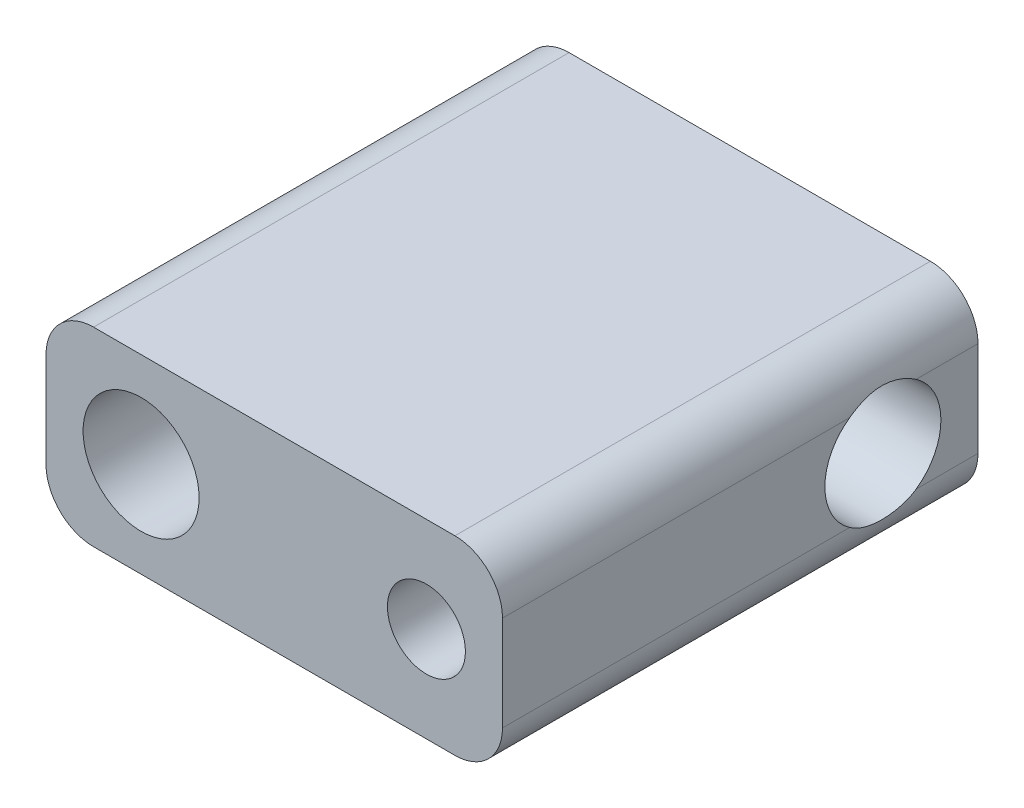
ISO-10303-21;
HEADER;
FILE_DESCRIPTION(('STEP AP214'),'2;1');
FILE_NAME('part.step','',(''),(''),'','','');
FILE_SCHEMA(('AUTOMOTIVE_DESIGN { 1 0 10303 214 1 1 1 1 }'));
ENDSEC;
DATA;
#1=APPLICATION_CONTEXT('core data for automotive mechanical design processes');
#2=APPLICATION_PROTOCOL_DEFINITION('international standard','automotive_design',2000,#1);
#3=PRODUCT_CONTEXT('',#1,'mechanical');
#4=PRODUCT('Part','Part','',(#3));
#5=PRODUCT_RELATED_PRODUCT_CATEGORY('part','',(#4));
#6=PRODUCT_DEFINITION_FORMATION('','',#4);
#7=PRODUCT_DEFINITION_CONTEXT('part definition',#1,'design');
#8=PRODUCT_DEFINITION('design','',#6,#7);
#9=PRODUCT_DEFINITION_SHAPE('','',#8);
#10=(LENGTH_UNIT() NAMED_UNIT(*) SI_UNIT(.MILLI.,.METRE.));
#11=(NAMED_UNIT(*) PLANE_ANGLE_UNIT() SI_UNIT($,.RADIAN.));
#12=(NAMED_UNIT(*) SI_UNIT($,.STERADIAN.) SOLID_ANGLE_UNIT());
#13=UNCERTAINTY_MEASURE_WITH_UNIT(LENGTH_MEASURE(1.E-05),#10,'distance_accuracy_value','');
#14=(GEOMETRIC_REPRESENTATION_CONTEXT(3) GLOBAL_UNCERTAINTY_ASSIGNED_CONTEXT((#13)) GLOBAL_UNIT_ASSIGNED_CONTEXT((#10,
#11,#12)) REPRESENTATION_CONTEXT('',''));
#15=CARTESIAN_POINT('',(0.,0.,0.));
#16=DIRECTION('',(0.,0.,1.));
#17=DIRECTION('',(1.,0.,0.));
#18=AXIS2_PLACEMENT_3D('',#15,#16,#17);
#19=CARTESIAN_POINT('',(24.,10.,30.));
#20=DIRECTION('',(-1.,0.,0.));
#21=DIRECTION('',(0.,0.,1.));
#22=AXIS2_PLACEMENT_3D('',#19,#20,#21);
#23=PLANE('',#22);
#24=DIRECTION('',(0.,1.,0.));
#25=VECTOR('',#24,1.);
#26=CARTESIAN_POINT('',(24.,10.,30.));
#27=LINE('',#26,#25);
#28=CARTESIAN_POINT('',(24.,-5.,30.));
#29=VERTEX_POINT('',#28);
#30=CARTESIAN_POINT('',(24.,5.,30.));
#31=VERTEX_POINT('',#30);
#32=EDGE_CURVE('E237',#29,#31,#27,.T.);
#33=ORIENTED_EDGE('',*,*,#32,.F.);
#34=DIRECTION('',(0.,0.,-1.));
#35=VECTOR('',#34,1.);
#36=CARTESIAN_POINT('',(24.,-5.,30.));
#37=LINE('',#36,#35);
#38=CARTESIAN_POINT('',(24.,-5.,-6.50571895806876));
#39=VERTEX_POINT('',#38);
#40=EDGE_CURVE('E172',#29,#39,#37,.T.);
#41=ORIENTED_EDGE('',*,*,#40,.T.);
#42=CARTESIAN_POINT('',(24.,0.,-10.));
#43=DIRECTION('',(1.,0.,0.));
#44=DIRECTION('',(0.,0.,-1.));
#45=AXIS2_PLACEMENT_3D('',#42,#43,#44);
#46=CIRCLE('',#45,6.1);
#47=CARTESIAN_POINT('',(24.,5.,-6.50571895806876));
#48=VERTEX_POINT('',#47);
#49=EDGE_CURVE('E336',#48,#39,#46,.T.);
#50=ORIENTED_EDGE('',*,*,#49,.F.);
#51=DIRECTION('',(0.,0.,-1.));
#52=VECTOR('',#51,1.);
#53=CARTESIAN_POINT('',(24.,5.,30.));
#54=LINE('',#53,#52);
#55=EDGE_CURVE('E166',#48,#31,#54,.F.);
#56=ORIENTED_EDGE('',*,*,#55,.T.);
#57=EDGE_LOOP('',(#33,#41,#50,#56));
#58=FACE_BOUND('',#57,.T.);
#59=ADVANCED_FACE('F33',(#58),#23,.F.);
#60=CARTESIAN_POINT('',(0.,0.,30.));
#61=DIRECTION('',(0.,0.,1.));
#62=DIRECTION('',(1.,0.,0.));
#63=AXIS2_PLACEMENT_3D('',#60,#61,#62);
#64=PLANE('',#63);
#65=CARTESIAN_POINT('',(-14.,0.,30.));
#66=DIRECTION('',(0.,0.,1.));
#67=DIRECTION('',(1.,0.,0.));
#68=AXIS2_PLACEMENT_3D('',#65,#66,#67);
#69=CIRCLE('',#68,6.1);
#70=CARTESIAN_POINT('',(-7.9,0.,30.));
#71=VERTEX_POINT('',#70);
#72=EDGE_CURVE('E243',#71,#71,#69,.T.);
#73=ORIENTED_EDGE('',*,*,#72,.F.);
#74=EDGE_LOOP('',(#73));
#75=FACE_BOUND('',#74,.T.);
#76=DIRECTION('',(0.,-1.,0.));
#77=VECTOR('',#76,1.);
#78=CARTESIAN_POINT('',(-24.,10.,30.));
#79=LINE('',#78,#77);
#80=CARTESIAN_POINT('',(-24.,5.,30.));
#81=VERTEX_POINT('',#80);
#82=CARTESIAN_POINT('',(-24.,-5.,30.));
#83=VERTEX_POINT('',#82);
#84=EDGE_CURVE('E141',#81,#83,#79,.T.);
#85=ORIENTED_EDGE('',*,*,#84,.T.);
#86=CARTESIAN_POINT('',(-19.,-5.,30.));
#87=DIRECTION('',(0.,0.,1.));
#88=DIRECTION('',(1.,0.,0.));
#89=AXIS2_PLACEMENT_3D('',#86,#87,#88);
#90=CIRCLE('',#89,5.);
#91=CARTESIAN_POINT('',(-19.,-10.,30.));
#92=VERTEX_POINT('',#91);
#93=EDGE_CURVE('E159',#83,#92,#90,.T.);
#94=ORIENTED_EDGE('',*,*,#93,.T.);
#95=DIRECTION('',(1.,0.,0.));
#96=VECTOR('',#95,1.);
#97=CARTESIAN_POINT('',(-24.,-10.,30.));
#98=LINE('',#97,#96);
#99=CARTESIAN_POINT('',(19.,-10.,30.));
#100=VERTEX_POINT('',#99);
#101=EDGE_CURVE('E138',#92,#100,#98,.T.);
#102=ORIENTED_EDGE('',*,*,#101,.T.);
#103=CARTESIAN_POINT('',(19.,-5.,30.));
#104=DIRECTION('',(0.,0.,1.));
#105=DIRECTION('',(1.,0.,0.));
#106=AXIS2_PLACEMENT_3D('',#103,#104,#105);
#107=CIRCLE('',#106,5.);
#108=EDGE_CURVE('E137',#100,#29,#107,.T.);
#109=ORIENTED_EDGE('',*,*,#108,.T.);
#110=ORIENTED_EDGE('',*,*,#32,.T.);
#111=CARTESIAN_POINT('',(19.,5.,30.));
#112=DIRECTION('',(0.,0.,1.));
#113=DIRECTION('',(1.,0.,0.));
#114=AXIS2_PLACEMENT_3D('',#111,#112,#113);
#115=CIRCLE('',#114,5.);
#116=CARTESIAN_POINT('',(19.,10.,30.));
#117=VERTEX_POINT('',#116);
#118=EDGE_CURVE('E154',#31,#117,#115,.T.);
#119=ORIENTED_EDGE('',*,*,#118,.T.);
#120=DIRECTION('',(-1.,0.,0.));
#121=VECTOR('',#120,1.);
#122=CARTESIAN_POINT('',(-24.,10.,30.));
#123=LINE('',#122,#121);
#124=CARTESIAN_POINT('',(-19.,10.,30.));
#125=VERTEX_POINT('',#124);
#126=EDGE_CURVE('E242',#117,#125,#123,.T.);
#127=ORIENTED_EDGE('',*,*,#126,.T.);
#128=CARTESIAN_POINT('',(-19.,5.,30.));
#129=DIRECTION('',(0.,0.,1.));
#130=DIRECTION('',(1.,0.,0.));
#131=AXIS2_PLACEMENT_3D('',#128,#129,#130);
#132=CIRCLE('',#131,5.);
#133=EDGE_CURVE('E157',#125,#81,#132,.T.);
#134=ORIENTED_EDGE('',*,*,#133,.T.);
#135=EDGE_LOOP('',(#85,#94,#102,#109,#110,#119,#127,#134));
#136=FACE_BOUND('',#135,.T.);
#137=CARTESIAN_POINT('',(16.,0.,30.));
#138=DIRECTION('',(0.,0.,1.));
#139=DIRECTION('',(1.,0.,0.));
#140=AXIS2_PLACEMENT_3D('',#137,#138,#139);
#141=CIRCLE('',#140,4.1);
#142=CARTESIAN_POINT('',(20.1,0.,30.));
#143=VERTEX_POINT('',#142);
#144=EDGE_CURVE('E267',#143,#143,#141,.T.);
#145=ORIENTED_EDGE('',*,*,#144,.F.);
#146=EDGE_LOOP('',(#145));
#147=FACE_BOUND('',#146,.T.);
#148=ADVANCED_FACE('F199',(#75,#136,#147),#64,.T.);
#149=CARTESIAN_POINT('',(24.,-5.,-13.4942810419312));
#150=VERTEX_POINT('',#149);
#151=CARTESIAN_POINT('',(24.,5.,-13.4942810419312));
#152=VERTEX_POINT('',#151);
#153=EDGE_CURVE('E338',#150,#152,#46,.T.);
#154=ORIENTED_EDGE('',*,*,#153,.F.);
#155=DIRECTION('',(0.,0.,-1.));
#156=VECTOR('',#155,1.);
#157=CARTESIAN_POINT('',(24.,-5.,30.));
#158=LINE('',#157,#156);
#159=CARTESIAN_POINT('',(24.,-5.,-20.));
#160=VERTEX_POINT('',#159);
#161=EDGE_CURVE('E170',#150,#160,#158,.T.);
#162=ORIENTED_EDGE('',*,*,#161,.T.);
#163=DIRECTION('',(0.,-1.,0.));
#164=VECTOR('',#163,1.);
#165=CARTESIAN_POINT('',(24.,10.,-20.));
#166=LINE('',#165,#164);
#167=CARTESIAN_POINT('',(24.,5.,-20.));
#168=VERTEX_POINT('',#167);
#169=EDGE_CURVE('E120',#168,#160,#166,.T.);
#170=ORIENTED_EDGE('',*,*,#169,.F.);
#171=DIRECTION('',(0.,0.,-1.));
#172=VECTOR('',#171,1.);
#173=CARTESIAN_POINT('',(24.,5.,30.));
#174=LINE('',#173,#172);
#175=EDGE_CURVE('E168',#168,#152,#174,.F.);
#176=ORIENTED_EDGE('',*,*,#175,.T.);
#177=EDGE_LOOP('',(#154,#162,#170,#176));
#178=FACE_BOUND('',#177,.T.);
#179=ADVANCED_FACE('F202',(#178),#23,.F.);
#180=CARTESIAN_POINT('',(-24.,10.,30.));
#181=DIRECTION('',(0.,-1.,0.));
#182=DIRECTION('',(0.,0.,-1.));
#183=AXIS2_PLACEMENT_3D('',#180,#181,#182);
#184=PLANE('',#183);
#185=DIRECTION('',(1.,0.,0.));
#186=VECTOR('',#185,1.);
#187=CARTESIAN_POINT('',(24.,10.,-20.));
#188=LINE('',#187,#186);
#189=CARTESIAN_POINT('',(-19.,10.,-20.));
#190=VERTEX_POINT('',#189);
#191=CARTESIAN_POINT('',(19.,10.,-20.));
#192=VERTEX_POINT('',#191);
#193=EDGE_CURVE('E260',#190,#192,#188,.T.);
#194=ORIENTED_EDGE('',*,*,#193,.F.);
#195=DIRECTION('',(0.,0.,-1.));
#196=VECTOR('',#195,1.);
#197=CARTESIAN_POINT('',(-19.,10.,30.));
#198=LINE('',#197,#196);
#199=EDGE_CURVE('E164',#190,#125,#198,.F.);
#200=ORIENTED_EDGE('',*,*,#199,.T.);
#201=ORIENTED_EDGE('',*,*,#126,.F.);
#202=DIRECTION('',(0.,0.,-1.));
#203=VECTOR('',#202,1.);
#204=CARTESIAN_POINT('',(19.,10.,30.));
#205=LINE('',#204,#203);
#206=EDGE_CURVE('E161',#117,#192,#205,.T.);
#207=ORIENTED_EDGE('',*,*,#206,.T.);
#208=EDGE_LOOP('',(#194,#200,#201,#207));
#209=FACE_BOUND('',#208,.T.);
#210=ADVANCED_FACE('F209',(#209),#184,.F.);
#211=CARTESIAN_POINT('',(-24.,10.,30.));
#212=DIRECTION('',(1.,0.,0.));
#213=DIRECTION('',(0.,1.,0.));
#214=AXIS2_PLACEMENT_3D('',#211,#212,#213);
#215=PLANE('',#214);
#216=DIRECTION('',(0.,1.,0.));
#217=VECTOR('',#216,1.);
#218=CARTESIAN_POINT('',(-24.,10.,-20.));
#219=LINE('',#218,#217);
#220=CARTESIAN_POINT('',(-24.,-5.,-20.));
#221=VERTEX_POINT('',#220);
#222=CARTESIAN_POINT('',(-24.,5.,-20.));
#223=VERTEX_POINT('',#222);
#224=EDGE_CURVE('E133',#221,#223,#219,.T.);
#225=ORIENTED_EDGE('',*,*,#224,.F.);
#226=DIRECTION('',(0.,0.,-1.));
#227=VECTOR('',#226,1.);
#228=CARTESIAN_POINT('',(-24.,-5.,30.));
#229=LINE('',#228,#227);
#230=EDGE_CURVE('E152',#221,#83,#229,.F.);
#231=ORIENTED_EDGE('',*,*,#230,.T.);
#232=ORIENTED_EDGE('',*,*,#84,.F.);
#233=DIRECTION('',(0.,0.,-1.));
#234=VECTOR('',#233,1.);
#235=CARTESIAN_POINT('',(-24.,5.,30.));
#236=LINE('',#235,#234);
#237=EDGE_CURVE('E149',#81,#223,#236,.T.);
#238=ORIENTED_EDGE('',*,*,#237,.T.);
#239=EDGE_LOOP('',(#225,#231,#232,#238));
#240=FACE_BOUND('',#239,.T.);
#241=ADVANCED_FACE('F206',(#240),#215,.F.);
#242=CARTESIAN_POINT('',(-24.,-10.,30.));
#243=DIRECTION('',(0.,1.,0.));
#244=DIRECTION('',(0.,0.,1.));
#245=AXIS2_PLACEMENT_3D('',#242,#243,#244);
#246=PLANE('',#245);
#247=ORIENTED_EDGE('',*,*,#101,.F.);
#248=DIRECTION('',(0.,0.,-1.));
#249=VECTOR('',#248,1.);
#250=CARTESIAN_POINT('',(-19.,-10.,30.));
#251=LINE('',#250,#249);
#252=CARTESIAN_POINT('',(-19.,-10.,-20.));
#253=VERTEX_POINT('',#252);
#254=EDGE_CURVE('E132',#92,#253,#251,.T.);
#255=ORIENTED_EDGE('',*,*,#254,.T.);
#256=DIRECTION('',(-1.,0.,0.));
#257=VECTOR('',#256,1.);
#258=CARTESIAN_POINT('',(24.,-10.,-20.));
#259=LINE('',#258,#257);
#260=CARTESIAN_POINT('',(19.,-10.,-20.));
#261=VERTEX_POINT('',#260);
#262=EDGE_CURVE('E118',#261,#253,#259,.T.);
#263=ORIENTED_EDGE('',*,*,#262,.F.);
#264=DIRECTION('',(0.,0.,-1.));
#265=VECTOR('',#264,1.);
#266=CARTESIAN_POINT('',(19.,-10.,30.));
#267=LINE('',#266,#265);
#268=EDGE_CURVE('E129',#261,#100,#267,.F.);
#269=ORIENTED_EDGE('',*,*,#268,.T.);
#270=EDGE_LOOP('',(#247,#255,#263,#269));
#271=FACE_BOUND('',#270,.T.);
#272=ADVANCED_FACE('F128',(#271),#246,.F.);
#273=CARTESIAN_POINT('',(-14.,0.,30.));
#274=DIRECTION('',(0.,0.,-1.));
#275=DIRECTION('',(-1.,0.,0.));
#276=AXIS2_PLACEMENT_3D('',#273,#274,#275);
#277=CYLINDRICAL_SURFACE('',#276,6.1);
#278=ORIENTED_EDGE('',*,*,#72,.T.);
#279=EDGE_LOOP('',(#278));
#280=FACE_BOUND('',#279,.T.);
#281=CARTESIAN_POINT('',(-14.,0.,0.));
#282=DIRECTION('',(0.,0.,1.));
#283=DIRECTION('',(1.,0.,0.));
#284=AXIS2_PLACEMENT_3D('',#281,#282,#283);
#285=CIRCLE('',#284,6.1);
#286=CARTESIAN_POINT('',(-7.9,0.,0.));
#287=VERTEX_POINT('',#286);
#288=EDGE_CURVE('E248',#287,#287,#285,.T.);
#289=ORIENTED_EDGE('',*,*,#288,.F.);
#290=EDGE_LOOP('',(#289));
#291=FACE_BOUND('',#290,.T.);
#292=ADVANCED_FACE('F194',(#280,#291),#277,.F.);
#293=CARTESIAN_POINT('',(16.,0.,30.));
#294=DIRECTION('',(0.,0.,-1.));
#295=DIRECTION('',(-1.,0.,0.));
#296=AXIS2_PLACEMENT_3D('',#293,#294,#295);
#297=CYLINDRICAL_SURFACE('',#296,4.1);
#298=ORIENTED_EDGE('',*,*,#144,.T.);
#299=EDGE_LOOP('',(#298));
#300=FACE_BOUND('',#299,.T.);
#301=CARTESIAN_POINT('',(16.,0.,0.));
#302=DIRECTION('',(0.,0.,1.));
#303=DIRECTION('',(1.,0.,0.));
#304=AXIS2_PLACEMENT_3D('',#301,#302,#303);
#305=CIRCLE('',#304,4.1);
#306=CARTESIAN_POINT('',(20.1,0.,0.));
#307=VERTEX_POINT('',#306);
#308=EDGE_CURVE('E263',#307,#307,#305,.T.);
#309=ORIENTED_EDGE('',*,*,#308,.F.);
#310=EDGE_LOOP('',(#309));
#311=FACE_BOUND('',#310,.T.);
#312=ADVANCED_FACE('F191',(#300,#311),#297,.F.);
#313=CARTESIAN_POINT('',(0.,0.,0.));
#314=DIRECTION('',(0.,0.,-1.));
#315=DIRECTION('',(-1.,0.,0.));
#316=AXIS2_PLACEMENT_3D('',#313,#314,#315);
#317=PLANE('',#316);
#318=ORIENTED_EDGE('',*,*,#308,.T.);
#319=EDGE_LOOP('',(#318));
#320=FACE_BOUND('',#319,.T.);
#321=ADVANCED_FACE('F189',(#320),#317,.F.);
#322=ORIENTED_EDGE('',*,*,#288,.T.);
#323=EDGE_LOOP('',(#322));
#324=FACE_BOUND('',#323,.T.);
#325=ADVANCED_FACE('F186',(#324),#317,.F.);
#326=CARTESIAN_POINT('',(0.,0.,-20.));
#327=DIRECTION('',(0.,0.,-1.));
#328=DIRECTION('',(-1.,0.,0.));
#329=AXIS2_PLACEMENT_3D('',#326,#327,#328);
#330=PLANE('',#329);
#331=ORIENTED_EDGE('',*,*,#262,.T.);
#332=CARTESIAN_POINT('',(-19.,-5.,-20.));
#333=DIRECTION('',(0.,0.,-1.));
#334=DIRECTION('',(-1.,0.,0.));
#335=AXIS2_PLACEMENT_3D('',#332,#333,#334);
#336=CIRCLE('',#335,5.);
#337=EDGE_CURVE('E147',#253,#221,#336,.T.);
#338=ORIENTED_EDGE('',*,*,#337,.T.);
#339=ORIENTED_EDGE('',*,*,#224,.T.);
#340=CARTESIAN_POINT('',(-19.,5.,-20.));
#341=DIRECTION('',(0.,0.,-1.));
#342=DIRECTION('',(-1.,0.,0.));
#343=AXIS2_PLACEMENT_3D('',#340,#341,#342);
#344=CIRCLE('',#343,5.);
#345=EDGE_CURVE('E122',#223,#190,#344,.T.);
#346=ORIENTED_EDGE('',*,*,#345,.T.);
#347=ORIENTED_EDGE('',*,*,#193,.T.);
#348=CARTESIAN_POINT('',(19.,5.,-20.));
#349=DIRECTION('',(0.,0.,-1.));
#350=DIRECTION('',(-1.,0.,0.));
#351=AXIS2_PLACEMENT_3D('',#348,#349,#350);
#352=CIRCLE('',#351,5.);
#353=EDGE_CURVE('E123',#192,#168,#352,.T.);
#354=ORIENTED_EDGE('',*,*,#353,.T.);
#355=ORIENTED_EDGE('',*,*,#169,.T.);
#356=CARTESIAN_POINT('',(19.,-5.,-20.));
#357=DIRECTION('',(0.,0.,-1.));
#358=DIRECTION('',(-1.,0.,0.));
#359=AXIS2_PLACEMENT_3D('',#356,#357,#358);
#360=CIRCLE('',#359,5.);
#361=EDGE_CURVE('E115',#160,#261,#360,.T.);
#362=ORIENTED_EDGE('',*,*,#361,.T.);
#363=EDGE_LOOP('',(#331,#338,#339,#346,#347,#354,#355,#362));
#364=FACE_BOUND('',#363,.T.);
#365=ADVANCED_FACE('F117',(#364),#330,.T.);
#366=CARTESIAN_POINT('',(-16.,0.,-10.));
#367=DIRECTION('',(1.,0.,0.));
#368=DIRECTION('',(0.,0.,-1.));
#369=AXIS2_PLACEMENT_3D('',#366,#367,#368);
#370=CYLINDRICAL_SURFACE('',#369,6.1);
#371=CARTESIAN_POINT('',(-16.,0.,-10.));
#372=DIRECTION('',(1.,0.,0.));
#373=DIRECTION('',(0.,0.,-1.));
#374=AXIS2_PLACEMENT_3D('',#371,#372,#373);
#375=CIRCLE('',#374,6.1);
#376=CARTESIAN_POINT('',(-16.,0.,-16.1));
#377=VERTEX_POINT('',#376);
#378=EDGE_CURVE('E335',#377,#377,#375,.T.);
#379=ORIENTED_EDGE('',*,*,#378,.F.);
#380=EDGE_LOOP('',(#379));
#381=FACE_BOUND('',#380,.T.);
#382=ORIENTED_EDGE('',*,*,#49,.T.);
#383=CARTESIAN_POINT('',(24.,-5.,-6.50571895806876));
#384=CARTESIAN_POINT('',(23.9999703037527,-5.09759947789048,-6.64534341689481));
#385=CARTESIAN_POINT('',(23.9971416051972,-5.1892903110942,-6.78903235995352));
#386=CARTESIAN_POINT('',(23.9877458916684,-5.36027465910384,-7.08343314533056));
#387=CARTESIAN_POINT('',(23.9811801400546,-5.43957235203098,-7.234142598473));
#388=CARTESIAN_POINT('',(23.9661647606248,-5.58528345014928,-7.54162974957637));
#389=CARTESIAN_POINT('',(23.9577144517804,-5.65169218134777,-7.69840962425705));
#390=CARTESIAN_POINT('',(23.9405397178031,-5.77117970473285,-8.01696695312011));
#391=CARTESIAN_POINT('',(23.9318152749207,-5.82425763177275,-8.17874473089322));
#392=CARTESIAN_POINT('',(23.9154683520928,-5.91672059013415,-8.50622428995917));
#393=CARTESIAN_POINT('',(23.9078458727517,-5.95610561394387,-8.67192607340464));
#394=CARTESIAN_POINT('',(23.8947796384343,-6.02089541982014,-9.00612512497531));
#395=CARTESIAN_POINT('',(23.8893358261812,-6.04630056942083,-9.17462231948853));
#396=CARTESIAN_POINT('',(23.8813570747096,-6.08291530360525,-9.51308109539217));
#397=CARTESIAN_POINT('',(23.8788197110807,-6.09413672034142,-9.68304133696232));
#398=CARTESIAN_POINT('',(23.8769754039039,-6.10232900430954,-10.0233197224198));
#399=CARTESIAN_POINT('',(23.8776683866821,-6.09930019654412,-10.1936378580562));
#400=CARTESIAN_POINT('',(23.8821753131202,-6.07910541195782,-10.5319232735302));
#401=CARTESIAN_POINT('',(23.885962442429,-6.06206088930823,-10.6998981881469));
#402=CARTESIAN_POINT('',(23.8961355170165,-6.01412780940978,-11.0337876292772));
#403=CARTESIAN_POINT('',(23.9025216367271,-5.98323832293921,-11.1997020167277));
#404=CARTESIAN_POINT('',(23.9170426078665,-5.90783492930779,-11.5283699963989));
#405=CARTESIAN_POINT('',(23.9251778602606,-5.86331789722108,-11.6911228545382));
#406=CARTESIAN_POINT('',(23.9420206343921,-5.76099545658676,-12.0122997578142));
#407=CARTESIAN_POINT('',(23.9507280330872,-5.70319289850497,-12.1707247233725));
#408=CARTESIAN_POINT('',(23.9699406091449,-5.55409399639736,-12.5320784250717));
#409=CARTESIAN_POINT('',(23.9801330528801,-5.45799531722986,-12.7330801013177));
#410=CARTESIAN_POINT('',(23.9914016159273,-5.29791265196604,-13.0256360438304));
#411=CARTESIAN_POINT('',(23.9944868853014,-5.24194922160858,-13.1215873821755));
#412=CARTESIAN_POINT('',(23.9987845346967,-5.12482908006586,-13.3103569304752));
#413=CARTESIAN_POINT('',(23.999996224627,-5.06367046409615,-13.4031739736761));
#414=CARTESIAN_POINT('',(24.,-5.,-13.4942810419312));
#415=B_SPLINE_CURVE_WITH_KNOTS('',3,(#383,#384,#385,#386,#387,#388,#389,#390,#391,#392,#393,
#394,#395,#396,#397,#398,#399,#400,#401,#402,#403,#404,#405,#406,#407,#408,#409,#410,#411,#412,
#413,#414),.UNSPECIFIED.,.F.,.F.,(4,2,2,2,2,2,2,2,2,2,2,2,2,2,2,4),(0.,0.510816996666516,
1.02146140747334,1.5322906513949,2.04315303871116,2.55401570628082,3.06486494251036,
3.57528774347575,4.0856989033645,4.59173309918853,5.09780126320447,5.60398556050447,
6.11006135503469,6.77759572026081,7.11080822939515,7.44414344066474),.UNSPECIFIED.);
#416=EDGE_CURVE('E11',#39,#150,#415,.T.);
#417=ORIENTED_EDGE('',*,*,#416,.T.);
#418=ORIENTED_EDGE('',*,*,#153,.T.);
#419=CARTESIAN_POINT('',(24.,5.,-13.4942810419312));
#420=CARTESIAN_POINT('',(23.9999703037527,5.09759947789048,-13.3546565831052));
#421=CARTESIAN_POINT('',(23.9971416051972,5.1892903110942,-13.2109676400465));
#422=CARTESIAN_POINT('',(23.9877458916684,5.36027465910384,-12.9165668546694));
#423=CARTESIAN_POINT('',(23.9811801400545,5.43957235203099,-12.765857401527));
#424=CARTESIAN_POINT('',(23.9661647606248,5.58528345014928,-12.4583702504236));
#425=CARTESIAN_POINT('',(23.9577144517804,5.65169218134777,-12.3015903757429));
#426=CARTESIAN_POINT('',(23.9405397178031,5.77117970473286,-11.9830330468799));
#427=CARTESIAN_POINT('',(23.9318152749207,5.82425763177276,-11.8212552691068));
#428=CARTESIAN_POINT('',(23.9154683520928,5.91672059013416,-11.4937757100408));
#429=CARTESIAN_POINT('',(23.9078458727517,5.95610561394387,-11.3280739265954));
#430=CARTESIAN_POINT('',(23.8947796384343,6.02089541982014,-10.9938748750247));
#431=CARTESIAN_POINT('',(23.8893358261812,6.04630056942083,-10.8253776805115));
#432=CARTESIAN_POINT('',(23.8813570747096,6.08291530360525,-10.4869189046078));
#433=CARTESIAN_POINT('',(23.8788197110807,6.09413672034142,-10.3169586630377));
#434=CARTESIAN_POINT('',(23.8769754039039,6.10232900430954,-9.97668027758017));
#435=CARTESIAN_POINT('',(23.8776683866821,6.09930019654412,-9.8063621419438));
#436=CARTESIAN_POINT('',(23.8821753131202,6.07910541195781,-9.46807672646982));
#437=CARTESIAN_POINT('',(23.885962442429,6.06206088930823,-9.30010181185311));
#438=CARTESIAN_POINT('',(23.8961355170165,6.01412780940978,-8.96621237072279));
#439=CARTESIAN_POINT('',(23.9025216367271,5.98323832293921,-8.80029798327224));
#440=CARTESIAN_POINT('',(23.9170426078665,5.90783492930779,-8.47163000360105));
#441=CARTESIAN_POINT('',(23.9251778602606,5.86331789722107,-8.30887714546178));
#442=CARTESIAN_POINT('',(23.9420206343921,5.76099545658676,-7.98770024218575));
#443=CARTESIAN_POINT('',(23.9507280330872,5.70319289850496,-7.82927527662752));
#444=CARTESIAN_POINT('',(23.9699406091449,5.55409399639735,-7.4679215749283));
#445=CARTESIAN_POINT('',(23.9801330528801,5.45799531722986,-7.26691989868232));
#446=CARTESIAN_POINT('',(23.9914016159273,5.29791265196604,-6.97436395616961));
#447=CARTESIAN_POINT('',(23.9944868853014,5.24194922160858,-6.87841261782455));
#448=CARTESIAN_POINT('',(23.9987845346967,5.12482908006586,-6.68964306952477));
#449=CARTESIAN_POINT('',(23.999996224627,5.06367046409616,-6.59682602632393));
#450=CARTESIAN_POINT('',(24.,5.,-6.50571895806876));
#451=B_SPLINE_CURVE_WITH_KNOTS('',3,(#419,#420,#421,#422,#423,#424,#425,#426,#427,#428,#429,
#430,#431,#432,#433,#434,#435,#436,#437,#438,#439,#440,#441,#442,#443,#444,#445,#446,#447,#448,
#449,#450),.UNSPECIFIED.,.F.,.F.,(4,2,2,2,2,2,2,2,2,2,2,2,2,2,2,4),(0.,0.510816996666518,
1.02146140747335,1.53229065139491,2.04315303871117,2.55401570628083,3.06486494251036,
3.57528774347576,4.08569890336451,4.59173309918853,5.09780126320448,5.60398556050448,
6.1100613550347,6.77759572026081,7.11080822939514,7.44414344066473),.UNSPECIFIED.);
#452=EDGE_CURVE('E46',#152,#48,#451,.T.);
#453=ORIENTED_EDGE('',*,*,#452,.T.);
#454=EDGE_LOOP('',(#382,#417,#418,#453));
#455=FACE_BOUND('',#454,.T.);
#456=ADVANCED_FACE('F176',(#381,#455),#370,.F.);
#457=CARTESIAN_POINT('',(-16.,0.,-10.));
#458=DIRECTION('',(1.,0.,0.));
#459=DIRECTION('',(0.,0.,-1.));
#460=AXIS2_PLACEMENT_3D('',#457,#458,#459);
#461=PLANE('',#460);
#462=ORIENTED_EDGE('',*,*,#378,.T.);
#463=EDGE_LOOP('',(#462));
#464=FACE_BOUND('',#463,.T.);
#465=ADVANCED_FACE('F181',(#464),#461,.T.);
#466=CARTESIAN_POINT('',(-19.,-5.,30.));
#467=DIRECTION('',(0.,0.,-1.));
#468=DIRECTION('',(-1.,0.,0.));
#469=AXIS2_PLACEMENT_3D('',#466,#467,#468);
#470=CYLINDRICAL_SURFACE('',#469,5.);
#471=ORIENTED_EDGE('',*,*,#93,.F.);
#472=ORIENTED_EDGE('',*,*,#230,.F.);
#473=ORIENTED_EDGE('',*,*,#337,.F.);
#474=ORIENTED_EDGE('',*,*,#254,.F.);
#475=EDGE_LOOP('',(#471,#472,#473,#474));
#476=FACE_BOUND('',#475,.T.);
#477=ADVANCED_FACE('F217',(#476),#470,.T.);
#478=CARTESIAN_POINT('',(-19.,5.,30.));
#479=DIRECTION('',(0.,0.,-1.));
#480=DIRECTION('',(-1.,0.,0.));
#481=AXIS2_PLACEMENT_3D('',#478,#479,#480);
#482=CYLINDRICAL_SURFACE('',#481,5.);
#483=ORIENTED_EDGE('',*,*,#133,.F.);
#484=ORIENTED_EDGE('',*,*,#199,.F.);
#485=ORIENTED_EDGE('',*,*,#345,.F.);
#486=ORIENTED_EDGE('',*,*,#237,.F.);
#487=EDGE_LOOP('',(#483,#484,#485,#486));
#488=FACE_BOUND('',#487,.T.);
#489=ADVANCED_FACE('F220',(#488),#482,.T.);
#490=CARTESIAN_POINT('',(19.,-5.,30.));
#491=DIRECTION('',(0.,0.,-1.));
#492=DIRECTION('',(-1.,0.,0.));
#493=AXIS2_PLACEMENT_3D('',#490,#491,#492);
#494=CYLINDRICAL_SURFACE('',#493,5.);
#495=ORIENTED_EDGE('',*,*,#108,.F.);
#496=ORIENTED_EDGE('',*,*,#268,.F.);
#497=ORIENTED_EDGE('',*,*,#361,.F.);
#498=ORIENTED_EDGE('',*,*,#161,.F.);
#499=ORIENTED_EDGE('',*,*,#416,.F.);
#500=ORIENTED_EDGE('',*,*,#40,.F.);
#501=EDGE_LOOP('',(#495,#496,#497,#498,#499,#500));
#502=FACE_BOUND('',#501,.T.);
#503=ADVANCED_FACE('F136',(#502),#494,.T.);
#504=CARTESIAN_POINT('',(19.,5.,30.));
#505=DIRECTION('',(0.,0.,-1.));
#506=DIRECTION('',(-1.,0.,0.));
#507=AXIS2_PLACEMENT_3D('',#504,#505,#506);
#508=CYLINDRICAL_SURFACE('',#507,5.);
#509=ORIENTED_EDGE('',*,*,#452,.F.);
#510=ORIENTED_EDGE('',*,*,#175,.F.);
#511=ORIENTED_EDGE('',*,*,#353,.F.);
#512=ORIENTED_EDGE('',*,*,#206,.F.);
#513=ORIENTED_EDGE('',*,*,#118,.F.);
#514=ORIENTED_EDGE('',*,*,#55,.F.);
#515=EDGE_LOOP('',(#509,#510,#511,#512,#513,#514));
#516=FACE_BOUND('',#515,.T.);
#517=ADVANCED_FACE('F35',(#516),#508,.T.);
#518=CLOSED_SHELL('',(#59,#148,#179,#210,#241,#272,#292,#312,#321,#325,#365,#456,#465,#477,#489,
#503,#517));
#519=MANIFOLD_SOLID_BREP('B2',#518);
#520=ADVANCED_BREP_SHAPE_REPRESENTATION('',(#18,#519),#14);
#521=SHAPE_DEFINITION_REPRESENTATION(#9,#520);
ENDSEC;
END-ISO-10303-21;
